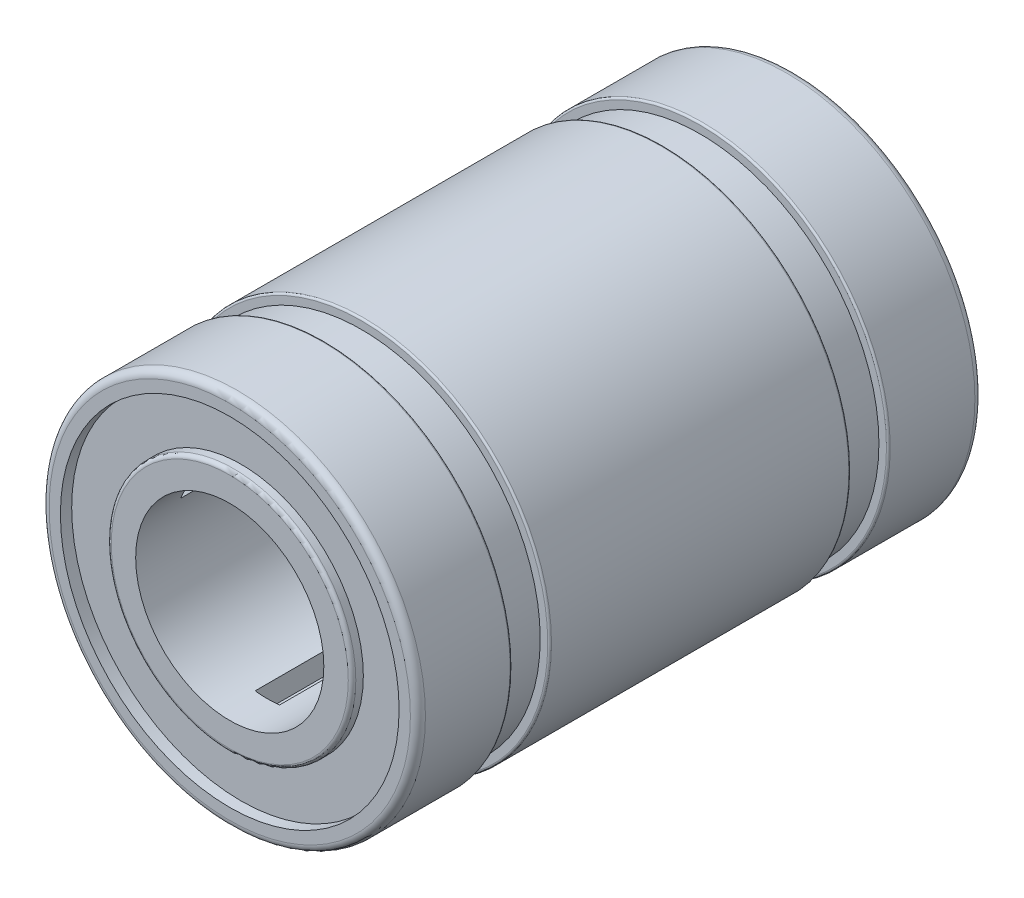
ISO-10303-21;
HEADER;
FILE_DESCRIPTION(('STEP AP214'),'2;1');
FILE_NAME('part.step','',(''),(''),'','','');
FILE_SCHEMA(('AUTOMOTIVE_DESIGN { 1 0 10303 214 1 1 1 1 }'));
ENDSEC;
DATA;
#1=APPLICATION_CONTEXT('core data for automotive mechanical design processes');
#2=APPLICATION_PROTOCOL_DEFINITION('international standard','automotive_design',2000,#1);
#3=PRODUCT_CONTEXT('',#1,'mechanical');
#4=PRODUCT('Part','Part','',(#3));
#5=PRODUCT_RELATED_PRODUCT_CATEGORY('part','',(#4));
#6=PRODUCT_DEFINITION_FORMATION('','',#4);
#7=PRODUCT_DEFINITION_CONTEXT('part definition',#1,'design');
#8=PRODUCT_DEFINITION('design','',#6,#7);
#9=PRODUCT_DEFINITION_SHAPE('','',#8);
#10=(LENGTH_UNIT() NAMED_UNIT(*) SI_UNIT(.MILLI.,.METRE.));
#11=(NAMED_UNIT(*) PLANE_ANGLE_UNIT() SI_UNIT($,.RADIAN.));
#12=(NAMED_UNIT(*) SI_UNIT($,.STERADIAN.) SOLID_ANGLE_UNIT());
#13=UNCERTAINTY_MEASURE_WITH_UNIT(LENGTH_MEASURE(1.E-05),#10,'distance_accuracy_value','');
#14=(GEOMETRIC_REPRESENTATION_CONTEXT(3) GLOBAL_UNCERTAINTY_ASSIGNED_CONTEXT((#13)) GLOBAL_UNIT_ASSIGNED_CONTEXT((#10,
#11,#12)) REPRESENTATION_CONTEXT('',''));
#15=CARTESIAN_POINT('',(0.,0.,0.));
#16=DIRECTION('',(0.,0.,1.));
#17=DIRECTION('',(1.,0.,0.));
#18=AXIS2_PLACEMENT_3D('',#15,#16,#17);
#19=CARTESIAN_POINT('',(-1.83838215350508,0.686207822560546,6.5));
#20=DIRECTION('',(-0.499999999999992,-0.866025403784443,0.));
#21=DIRECTION('',(0.866025403784443,-0.499999999999992,0.));
#22=AXIS2_PLACEMENT_3D('',#19,#20,#21);
#23=PLANE('',#22);
#24=DIRECTION('',(0.866025403784443,-0.499999999999992,0.));
#25=VECTOR('',#24,1.);
#26=CARTESIAN_POINT('',(-1.83838215350508,0.686207822560546,-6.5));
#27=LINE('',#26,#25);
#28=CARTESIAN_POINT('',(-2.81666253555662,1.25101826448092,-6.5));
#29=VERTEX_POINT('',#28);
#30=CARTESIAN_POINT('',(-2.30915894936689,0.958010932379585,-6.5));
#31=VERTEX_POINT('',#30);
#32=EDGE_CURVE('E184',#29,#31,#27,.T.);
#33=ORIENTED_EDGE('',*,*,#32,.F.);
#34=DIRECTION('',(0.,0.,-1.));
#35=VECTOR('',#34,1.);
#36=CARTESIAN_POINT('',(-2.81666253555662,1.25101826448092,6.5));
#37=LINE('',#36,#35);
#38=CARTESIAN_POINT('',(-2.81666253555662,1.25101826448092,6.5));
#39=VERTEX_POINT('',#38);
#40=EDGE_CURVE('E170',#39,#29,#37,.T.);
#41=ORIENTED_EDGE('',*,*,#40,.F.);
#42=DIRECTION('',(-0.866025403784443,0.499999999999992,0.));
#43=VECTOR('',#42,1.);
#44=CARTESIAN_POINT('',(-1.83838215350508,0.686207822560546,6.5));
#45=LINE('',#44,#43);
#46=CARTESIAN_POINT('',(-2.30915894936689,0.958010932379585,6.5));
#47=VERTEX_POINT('',#46);
#48=EDGE_CURVE('E186',#47,#39,#45,.T.);
#49=ORIENTED_EDGE('',*,*,#48,.F.);
#50=DIRECTION('',(0.,0.,-1.));
#51=VECTOR('',#50,1.);
#52=CARTESIAN_POINT('',(-2.30915894936689,0.958010932379585,12.8));
#53=LINE('',#52,#51);
#54=EDGE_CURVE('E62',#31,#47,#53,.F.);
#55=ORIENTED_EDGE('',*,*,#54,.F.);
#56=EDGE_LOOP('',(#33,#41,#49,#55));
#57=FACE_BOUND('',#56,.T.);
#58=ADVANCED_FACE('F47',(#57),#23,.F.);
#59=CARTESIAN_POINT('',(-1.5134644833656,1.24898173551904,6.5));
#60=DIRECTION('',(0.499999999999992,0.866025403784443,0.));
#61=DIRECTION('',(-0.866025403784443,0.499999999999992,0.));
#62=AXIS2_PLACEMENT_3D('',#59,#60,#61);
#63=PLANE('',#62);
#64=DIRECTION('',(-0.866025403784443,0.499999999999992,0.));
#65=VECTOR('',#64,1.);
#66=CARTESIAN_POINT('',(-1.5134644833656,1.24898173551904,-6.5));
#67=LINE('',#66,#65);
#68=CARTESIAN_POINT('',(-1.98424127922741,1.52078484533808,-6.5));
#69=VERTEX_POINT('',#68);
#70=CARTESIAN_POINT('',(-2.49174486541714,1.81379217743941,-6.5));
#71=VERTEX_POINT('',#70);
#72=EDGE_CURVE('E70',#69,#71,#67,.T.);
#73=ORIENTED_EDGE('',*,*,#72,.F.);
#74=DIRECTION('',(0.,0.,-1.));
#75=VECTOR('',#74,1.);
#76=CARTESIAN_POINT('',(-1.98424127922741,1.52078484533808,12.8));
#77=LINE('',#76,#75);
#78=CARTESIAN_POINT('',(-1.98424127922741,1.52078484533808,6.5));
#79=VERTEX_POINT('',#78);
#80=EDGE_CURVE('E230',#79,#69,#77,.T.);
#81=ORIENTED_EDGE('',*,*,#80,.F.);
#82=DIRECTION('',(0.866025403784443,-0.499999999999992,0.));
#83=VECTOR('',#82,1.);
#84=CARTESIAN_POINT('',(-1.5134644833656,1.24898173551904,6.5));
#85=LINE('',#84,#83);
#86=CARTESIAN_POINT('',(-2.49174486541714,1.81379217743941,6.5));
#87=VERTEX_POINT('',#86);
#88=EDGE_CURVE('E183',#87,#79,#85,.T.);
#89=ORIENTED_EDGE('',*,*,#88,.F.);
#90=DIRECTION('',(0.,0.,-1.));
#91=VECTOR('',#90,1.);
#92=CARTESIAN_POINT('',(-2.49174486541714,1.81379217743941,6.5));
#93=LINE('',#92,#91);
#94=EDGE_CURVE('E188',#87,#71,#93,.T.);
#95=ORIENTED_EDGE('',*,*,#94,.T.);
#96=EDGE_LOOP('',(#73,#81,#89,#95));
#97=FACE_BOUND('',#96,.T.);
#98=ADVANCED_FACE('F306',(#97),#63,.F.);
#99=CARTESIAN_POINT('',(-2.81666253555662,1.25101826448092,6.5));
#100=DIRECTION('',(-0.866025403784443,0.499999999999992,0.));
#101=DIRECTION('',(-0.499999999999992,-0.866025403784443,0.));
#102=AXIS2_PLACEMENT_3D('',#99,#100,#101);
#103=PLANE('',#102);
#104=DIRECTION('',(-0.499999999999992,-0.866025403784443,0.));
#105=VECTOR('',#104,1.);
#106=CARTESIAN_POINT('',(-2.81666253555662,1.25101826448092,-6.5));
#107=LINE('',#106,#105);
#108=EDGE_CURVE('E754',#71,#29,#107,.T.);
#109=ORIENTED_EDGE('',*,*,#108,.F.);
#110=ORIENTED_EDGE('',*,*,#94,.F.);
#111=DIRECTION('',(0.499999999999992,0.866025403784443,0.));
#112=VECTOR('',#111,1.);
#113=CARTESIAN_POINT('',(-2.81666253555662,1.25101826448092,6.5));
#114=LINE('',#113,#112);
#115=EDGE_CURVE('E180',#39,#87,#114,.T.);
#116=ORIENTED_EDGE('',*,*,#115,.F.);
#117=ORIENTED_EDGE('',*,*,#40,.T.);
#118=EDGE_LOOP('',(#109,#110,#116,#117));
#119=FACE_BOUND('',#118,.T.);
#120=ADVANCED_FACE('F311',(#119),#103,.F.);
#121=CARTESIAN_POINT('',(1.51346448336558,1.24898173551906,6.5));
#122=DIRECTION('',(-0.500000000000004,0.866025403784436,0.));
#123=DIRECTION('',(-0.866025403784436,-0.500000000000004,0.));
#124=AXIS2_PLACEMENT_3D('',#121,#122,#123);
#125=PLANE('',#124);
#126=DIRECTION('',(-0.866025403784436,-0.500000000000004,0.));
#127=VECTOR('',#126,1.);
#128=CARTESIAN_POINT('',(1.51346448336558,1.24898173551906,-6.5));
#129=LINE('',#128,#127);
#130=CARTESIAN_POINT('',(2.49174486541711,1.81379217743945,-6.5));
#131=VERTEX_POINT('',#130);
#132=CARTESIAN_POINT('',(1.98424127922739,1.52078484533811,-6.5));
#133=VERTEX_POINT('',#132);
#134=EDGE_CURVE('E757',#131,#133,#129,.T.);
#135=ORIENTED_EDGE('',*,*,#134,.F.);
#136=DIRECTION('',(0.,0.,-1.));
#137=VECTOR('',#136,1.);
#138=CARTESIAN_POINT('',(2.49174486541711,1.81379217743945,6.5));
#139=LINE('',#138,#137);
#140=CARTESIAN_POINT('',(2.49174486541711,1.81379217743945,6.5));
#141=VERTEX_POINT('',#140);
#142=EDGE_CURVE('E175',#141,#131,#139,.T.);
#143=ORIENTED_EDGE('',*,*,#142,.F.);
#144=DIRECTION('',(0.866025403784436,0.500000000000004,0.));
#145=VECTOR('',#144,1.);
#146=CARTESIAN_POINT('',(1.51346448336558,1.24898173551906,6.5));
#147=LINE('',#146,#145);
#148=CARTESIAN_POINT('',(1.98424127922739,1.52078484533811,6.5));
#149=VERTEX_POINT('',#148);
#150=EDGE_CURVE('E172',#149,#141,#147,.T.);
#151=ORIENTED_EDGE('',*,*,#150,.F.);
#152=DIRECTION('',(0.,0.,-1.));
#153=VECTOR('',#152,1.);
#154=CARTESIAN_POINT('',(1.98424127922739,1.52078484533811,12.8));
#155=LINE('',#154,#153);
#156=EDGE_CURVE('E239',#133,#149,#155,.F.);
#157=ORIENTED_EDGE('',*,*,#156,.F.);
#158=EDGE_LOOP('',(#135,#143,#151,#157));
#159=FACE_BOUND('',#158,.T.);
#160=ADVANCED_FACE('F319',(#159),#125,.F.);
#161=CARTESIAN_POINT('',(1.83838215350507,0.686207822560572,6.5));
#162=DIRECTION('',(0.500000000000004,-0.866025403784436,0.));
#163=DIRECTION('',(0.866025403784436,0.500000000000004,0.));
#164=AXIS2_PLACEMENT_3D('',#161,#162,#163);
#165=PLANE('',#164);
#166=DIRECTION('',(0.866025403784436,0.500000000000004,0.));
#167=VECTOR('',#166,1.);
#168=CARTESIAN_POINT('',(1.83838215350507,0.686207822560572,-6.5));
#169=LINE('',#168,#167);
#170=CARTESIAN_POINT('',(2.30915894936688,0.958010932379617,-6.5));
#171=VERTEX_POINT('',#170);
#172=CARTESIAN_POINT('',(2.8166625355566,1.25101826448096,-6.5));
#173=VERTEX_POINT('',#172);
#174=EDGE_CURVE('E761',#171,#173,#169,.T.);
#175=ORIENTED_EDGE('',*,*,#174,.F.);
#176=DIRECTION('',(0.,0.,-1.));
#177=VECTOR('',#176,1.);
#178=CARTESIAN_POINT('',(2.30915894936688,0.958010932379617,12.8));
#179=LINE('',#178,#177);
#180=CARTESIAN_POINT('',(2.30915894936688,0.958010932379617,6.5));
#181=VERTEX_POINT('',#180);
#182=EDGE_CURVE('E236',#181,#171,#179,.T.);
#183=ORIENTED_EDGE('',*,*,#182,.F.);
#184=DIRECTION('',(-0.866025403784436,-0.500000000000004,0.));
#185=VECTOR('',#184,1.);
#186=CARTESIAN_POINT('',(1.83838215350507,0.686207822560572,6.5));
#187=LINE('',#186,#185);
#188=CARTESIAN_POINT('',(2.8166625355566,1.25101826448096,6.5));
#189=VERTEX_POINT('',#188);
#190=EDGE_CURVE('E169',#189,#181,#187,.T.);
#191=ORIENTED_EDGE('',*,*,#190,.F.);
#192=DIRECTION('',(0.,0.,-1.));
#193=VECTOR('',#192,1.);
#194=CARTESIAN_POINT('',(2.8166625355566,1.25101826448096,6.5));
#195=LINE('',#194,#193);
#196=EDGE_CURVE('E174',#189,#173,#195,.T.);
#197=ORIENTED_EDGE('',*,*,#196,.T.);
#198=EDGE_LOOP('',(#175,#183,#191,#197));
#199=FACE_BOUND('',#198,.T.);
#200=ADVANCED_FACE('F538',(#199),#165,.F.);
#201=CARTESIAN_POINT('',(2.49174486541711,1.81379217743945,6.5));
#202=DIRECTION('',(0.866025403784436,0.500000000000004,0.));
#203=DIRECTION('',(-0.500000000000004,0.866025403784436,0.));
#204=AXIS2_PLACEMENT_3D('',#201,#202,#203);
#205=PLANE('',#204);
#206=DIRECTION('',(-0.500000000000004,0.866025403784436,0.));
#207=VECTOR('',#206,1.);
#208=CARTESIAN_POINT('',(2.49174486541711,1.81379217743945,-6.5));
#209=LINE('',#208,#207);
#210=EDGE_CURVE('E775',#173,#131,#209,.T.);
#211=ORIENTED_EDGE('',*,*,#210,.F.);
#212=ORIENTED_EDGE('',*,*,#196,.F.);
#213=DIRECTION('',(0.500000000000004,-0.866025403784436,0.));
#214=VECTOR('',#213,1.);
#215=CARTESIAN_POINT('',(2.49174486541711,1.81379217743945,6.5));
#216=LINE('',#215,#214);
#217=EDGE_CURVE('E166',#141,#189,#216,.T.);
#218=ORIENTED_EDGE('',*,*,#217,.F.);
#219=ORIENTED_EDGE('',*,*,#142,.T.);
#220=EDGE_LOOP('',(#211,#212,#218,#219));
#221=FACE_BOUND('',#220,.T.);
#222=ADVANCED_FACE('F549',(#221),#205,.F.);
#223=CARTESIAN_POINT('',(-0.324917670139485,-1.93518955807962,6.5));
#224=DIRECTION('',(-1.,0.,0.));
#225=DIRECTION('',(0.,0.,1.));
#226=AXIS2_PLACEMENT_3D('',#223,#224,#225);
#227=PLANE('',#226);
#228=DIRECTION('',(0.,-1.,0.));
#229=VECTOR('',#228,1.);
#230=CARTESIAN_POINT('',(-0.324917670139485,-1.93518955807962,-6.5));
#231=LINE('',#230,#229);
#232=CARTESIAN_POINT('',(-0.324917670139485,-2.47879577771771,-6.5));
#233=VERTEX_POINT('',#232);
#234=CARTESIAN_POINT('',(-0.324917670139485,-3.06481044192038,-6.5));
#235=VERTEX_POINT('',#234);
#236=EDGE_CURVE('E767',#233,#235,#231,.T.);
#237=ORIENTED_EDGE('',*,*,#236,.F.);
#238=DIRECTION('',(0.,0.,-1.));
#239=VECTOR('',#238,1.);
#240=CARTESIAN_POINT('',(-0.324917670139485,-2.47879577771771,12.8));
#241=LINE('',#240,#239);
#242=CARTESIAN_POINT('',(-0.324917670139485,-2.47879577771771,6.5));
#243=VERTEX_POINT('',#242);
#244=EDGE_CURVE('E244',#243,#233,#241,.T.);
#245=ORIENTED_EDGE('',*,*,#244,.F.);
#246=DIRECTION('',(0.,1.,0.));
#247=VECTOR('',#246,1.);
#248=CARTESIAN_POINT('',(-0.324917670139485,-1.93518955807962,6.5));
#249=LINE('',#248,#247);
#250=CARTESIAN_POINT('',(-0.324917670139485,-3.06481044192038,6.5));
#251=VERTEX_POINT('',#250);
#252=EDGE_CURVE('E147',#251,#243,#249,.T.);
#253=ORIENTED_EDGE('',*,*,#252,.F.);
#254=DIRECTION('',(0.,0.,-1.));
#255=VECTOR('',#254,1.);
#256=CARTESIAN_POINT('',(-0.324917670139485,-3.06481044192038,6.5));
#257=LINE('',#256,#255);
#258=EDGE_CURVE('E156',#251,#235,#257,.T.);
#259=ORIENTED_EDGE('',*,*,#258,.T.);
#260=EDGE_LOOP('',(#237,#245,#253,#259));
#261=FACE_BOUND('',#260,.T.);
#262=ADVANCED_FACE('F560',(#261),#227,.F.);
#263=CARTESIAN_POINT('',(0.324917670139485,-1.93518955807962,6.5));
#264=DIRECTION('',(1.,0.,0.));
#265=DIRECTION('',(0.,0.,-1.));
#266=AXIS2_PLACEMENT_3D('',#263,#264,#265);
#267=PLANE('',#266);
#268=DIRECTION('',(0.,1.,0.));
#269=VECTOR('',#268,1.);
#270=CARTESIAN_POINT('',(0.324917670139485,-1.93518955807962,-6.5));
#271=LINE('',#270,#269);
#272=CARTESIAN_POINT('',(0.324917670139485,-3.06481044192038,-6.5));
#273=VERTEX_POINT('',#272);
#274=CARTESIAN_POINT('',(0.324917670139485,-2.47879577771771,-6.5));
#275=VERTEX_POINT('',#274);
#276=EDGE_CURVE('E153',#273,#275,#271,.T.);
#277=ORIENTED_EDGE('',*,*,#276,.F.);
#278=DIRECTION('',(0.,0.,-1.));
#279=VECTOR('',#278,1.);
#280=CARTESIAN_POINT('',(0.324917670139485,-3.06481044192038,6.5));
#281=LINE('',#280,#279);
#282=CARTESIAN_POINT('',(0.324917670139485,-3.06481044192038,6.5));
#283=VERTEX_POINT('',#282);
#284=EDGE_CURVE('E150',#283,#273,#281,.T.);
#285=ORIENTED_EDGE('',*,*,#284,.F.);
#286=DIRECTION('',(0.,-1.,0.));
#287=VECTOR('',#286,1.);
#288=CARTESIAN_POINT('',(0.324917670139485,-1.93518955807962,6.5));
#289=LINE('',#288,#287);
#290=CARTESIAN_POINT('',(0.324917670139485,-2.47879577771771,6.5));
#291=VERTEX_POINT('',#290);
#292=EDGE_CURVE('E139',#291,#283,#289,.T.);
#293=ORIENTED_EDGE('',*,*,#292,.F.);
#294=DIRECTION('',(0.,0.,-1.));
#295=VECTOR('',#294,1.);
#296=CARTESIAN_POINT('',(0.324917670139485,-2.47879577771771,12.8));
#297=LINE('',#296,#295);
#298=EDGE_CURVE('E242',#275,#291,#297,.F.);
#299=ORIENTED_EDGE('',*,*,#298,.F.);
#300=EDGE_LOOP('',(#277,#285,#293,#299));
#301=FACE_BOUND('',#300,.T.);
#302=ADVANCED_FACE('F151',(#301),#267,.F.);
#303=CARTESIAN_POINT('',(0.324917670139485,-3.06481044192038,6.5));
#304=DIRECTION('',(0.,-1.,0.));
#305=DIRECTION('',(0.,0.,-1.));
#306=AXIS2_PLACEMENT_3D('',#303,#304,#305);
#307=PLANE('',#306);
#308=DIRECTION('',(1.,0.,0.));
#309=VECTOR('',#308,1.);
#310=CARTESIAN_POINT('',(0.324917670139485,-3.06481044192038,-6.5));
#311=LINE('',#310,#309);
#312=EDGE_CURVE('E247',#235,#273,#311,.T.);
#313=ORIENTED_EDGE('',*,*,#312,.F.);
#314=ORIENTED_EDGE('',*,*,#258,.F.);
#315=DIRECTION('',(-1.,0.,0.));
#316=VECTOR('',#315,1.);
#317=CARTESIAN_POINT('',(0.324917670139485,-3.06481044192038,6.5));
#318=LINE('',#317,#316);
#319=EDGE_CURVE('E143',#283,#251,#318,.T.);
#320=ORIENTED_EDGE('',*,*,#319,.F.);
#321=ORIENTED_EDGE('',*,*,#284,.T.);
#322=EDGE_LOOP('',(#313,#314,#320,#321));
#323=FACE_BOUND('',#322,.T.);
#324=ADVANCED_FACE('F158',(#323),#307,.F.);
#325=CARTESIAN_POINT('',(0.,0.,-4.));
#326=DIRECTION('',(0.,0.,1.));
#327=DIRECTION('',(1.,0.,0.));
#328=AXIS2_PLACEMENT_3D('',#325,#326,#327);
#329=CYLINDRICAL_SURFACE('',#328,5.);
#330=CARTESIAN_POINT('',(0.,0.,3.95));
#331=DIRECTION('',(0.,0.,1.));
#332=DIRECTION('',(1.,0.,0.));
#333=AXIS2_PLACEMENT_3D('',#330,#331,#332);
#334=CIRCLE('',#333,5.);
#335=CARTESIAN_POINT('',(5.,0.,3.95));
#336=VERTEX_POINT('',#335);
#337=EDGE_CURVE('E273',#336,#336,#334,.F.);
#338=ORIENTED_EDGE('',*,*,#337,.T.);
#339=EDGE_LOOP('',(#338));
#340=FACE_BOUND('',#339,.T.);
#341=CARTESIAN_POINT('',(0.,0.,-3.95));
#342=DIRECTION('',(0.,0.,1.));
#343=DIRECTION('',(1.,0.,0.));
#344=AXIS2_PLACEMENT_3D('',#341,#342,#343);
#345=CIRCLE('',#344,5.);
#346=CARTESIAN_POINT('',(5.,0.,-3.95));
#347=VERTEX_POINT('',#346);
#348=EDGE_CURVE('E270',#347,#347,#345,.T.);
#349=ORIENTED_EDGE('',*,*,#348,.T.);
#350=EDGE_LOOP('',(#349));
#351=FACE_BOUND('',#350,.T.);
#352=ADVANCED_FACE('F391',(#340,#351),#329,.T.);
#353=CARTESIAN_POINT('',(0.,0.,-4.));
#354=DIRECTION('',(0.,0.,1.));
#355=DIRECTION('',(1.,0.,0.));
#356=AXIS2_PLACEMENT_3D('',#353,#354,#355);
#357=PLANE('',#356);
#358=CARTESIAN_POINT('',(0.,0.,-4.));
#359=DIRECTION('',(0.,0.,1.));
#360=DIRECTION('',(1.,0.,0.));
#361=AXIS2_PLACEMENT_3D('',#358,#359,#360);
#362=CIRCLE('',#361,4.95);
#363=CARTESIAN_POINT('',(4.95,0.,-4.));
#364=VERTEX_POINT('',#363);
#365=EDGE_CURVE('E276',#364,#364,#362,.F.);
#366=ORIENTED_EDGE('',*,*,#365,.T.);
#367=EDGE_LOOP('',(#366));
#368=FACE_BOUND('',#367,.T.);
#369=CARTESIAN_POINT('',(0.,0.,-4.));
#370=DIRECTION('',(0.,0.,1.));
#371=DIRECTION('',(1.,0.,0.));
#372=AXIS2_PLACEMENT_3D('',#369,#370,#371);
#373=CIRCLE('',#372,4.75);
#374=CARTESIAN_POINT('',(4.75,0.,-4.));
#375=VERTEX_POINT('',#374);
#376=EDGE_CURVE('E217',#375,#375,#373,.T.);
#377=ORIENTED_EDGE('',*,*,#376,.T.);
#378=EDGE_LOOP('',(#377));
#379=FACE_BOUND('',#378,.T.);
#380=ADVANCED_FACE('F387',(#368,#379),#357,.F.);
#381=CARTESIAN_POINT('',(0.,0.,4.));
#382=DIRECTION('',(0.,0.,1.));
#383=DIRECTION('',(1.,0.,0.));
#384=AXIS2_PLACEMENT_3D('',#381,#382,#383);
#385=PLANE('',#384);
#386=CARTESIAN_POINT('',(0.,0.,4.));
#387=DIRECTION('',(0.,0.,1.));
#388=DIRECTION('',(1.,0.,0.));
#389=AXIS2_PLACEMENT_3D('',#386,#387,#388);
#390=CIRCLE('',#389,4.95);
#391=CARTESIAN_POINT('',(4.95,0.,4.));
#392=VERTEX_POINT('',#391);
#393=EDGE_CURVE('E267',#392,#392,#390,.T.);
#394=ORIENTED_EDGE('',*,*,#393,.T.);
#395=EDGE_LOOP('',(#394));
#396=FACE_BOUND('',#395,.T.);
#397=CARTESIAN_POINT('',(0.,0.,4.));
#398=DIRECTION('',(0.,0.,1.));
#399=DIRECTION('',(1.,0.,0.));
#400=AXIS2_PLACEMENT_3D('',#397,#398,#399);
#401=CIRCLE('',#400,4.75);
#402=CARTESIAN_POINT('',(4.75,0.,4.));
#403=VERTEX_POINT('',#402);
#404=EDGE_CURVE('E222',#403,#403,#401,.T.);
#405=ORIENTED_EDGE('',*,*,#404,.F.);
#406=EDGE_LOOP('',(#405));
#407=FACE_BOUND('',#406,.T.);
#408=ADVANCED_FACE('F383',(#396,#407),#385,.T.);
#409=CARTESIAN_POINT('',(0.,0.,-5.));
#410=DIRECTION('',(0.,0.,1.));
#411=DIRECTION('',(1.,0.,0.));
#412=AXIS2_PLACEMENT_3D('',#409,#410,#411);
#413=CYLINDRICAL_SURFACE('',#412,4.75);
#414=ORIENTED_EDGE('',*,*,#404,.T.);
#415=EDGE_LOOP('',(#414));
#416=FACE_BOUND('',#415,.T.);
#417=CARTESIAN_POINT('',(0.,0.,5.));
#418=DIRECTION('',(0.,0.,1.));
#419=DIRECTION('',(1.,0.,0.));
#420=AXIS2_PLACEMENT_3D('',#417,#418,#419);
#421=CIRCLE('',#420,4.75);
#422=CARTESIAN_POINT('',(4.75,0.,5.));
#423=VERTEX_POINT('',#422);
#424=EDGE_CURVE('E214',#423,#423,#421,.T.);
#425=ORIENTED_EDGE('',*,*,#424,.F.);
#426=EDGE_LOOP('',(#425));
#427=FACE_BOUND('',#426,.T.);
#428=ADVANCED_FACE('F380',(#416,#427),#413,.T.);
#429=CARTESIAN_POINT('',(0.,0.,-5.));
#430=DIRECTION('',(0.,0.,1.));
#431=DIRECTION('',(1.,0.,0.));
#432=AXIS2_PLACEMENT_3D('',#429,#430,#431);
#433=CIRCLE('',#432,4.75);
#434=CARTESIAN_POINT('',(4.75,0.,-5.));
#435=VERTEX_POINT('',#434);
#436=EDGE_CURVE('E211',#435,#435,#433,.T.);
#437=ORIENTED_EDGE('',*,*,#436,.T.);
#438=EDGE_LOOP('',(#437));
#439=FACE_BOUND('',#438,.T.);
#440=ORIENTED_EDGE('',*,*,#376,.F.);
#441=EDGE_LOOP('',(#440));
#442=FACE_BOUND('',#441,.T.);
#443=ADVANCED_FACE('F378',(#439,#442),#413,.T.);
#444=CARTESIAN_POINT('',(0.,0.,7.5));
#445=DIRECTION('',(0.,0.,-1.));
#446=DIRECTION('',(-1.,0.,0.));
#447=AXIS2_PLACEMENT_3D('',#444,#445,#446);
#448=CYLINDRICAL_SURFACE('',#447,5.);
#449=CARTESIAN_POINT('',(0.,0.,5.05));
#450=DIRECTION('',(0.,0.,1.));
#451=DIRECTION('',(1.,0.,0.));
#452=AXIS2_PLACEMENT_3D('',#449,#450,#451);
#453=CIRCLE('',#452,5.);
#454=CARTESIAN_POINT('',(5.,0.,5.05));
#455=VERTEX_POINT('',#454);
#456=EDGE_CURVE('E261',#455,#455,#453,.T.);
#457=ORIENTED_EDGE('',*,*,#456,.T.);
#458=EDGE_LOOP('',(#457));
#459=FACE_BOUND('',#458,.T.);
#460=CARTESIAN_POINT('',(0.,0.,7.3));
#461=DIRECTION('',(0.,0.,1.));
#462=DIRECTION('',(1.,0.,0.));
#463=AXIS2_PLACEMENT_3D('',#460,#461,#462);
#464=CIRCLE('',#463,5.);
#465=CARTESIAN_POINT('',(5.,0.,7.3));
#466=VERTEX_POINT('',#465);
#467=EDGE_CURVE('E252',#466,#466,#464,.F.);
#468=ORIENTED_EDGE('',*,*,#467,.T.);
#469=EDGE_LOOP('',(#468));
#470=FACE_BOUND('',#469,.T.);
#471=ADVANCED_FACE('F371',(#459,#470),#448,.T.);
#472=CARTESIAN_POINT('',(0.,0.,7.5));
#473=DIRECTION('',(0.,0.,1.));
#474=DIRECTION('',(1.,0.,0.));
#475=AXIS2_PLACEMENT_3D('',#472,#473,#474);
#476=PLANE('',#475);
#477=CARTESIAN_POINT('',(0.,0.,7.5));
#478=DIRECTION('',(0.,0.,1.));
#479=DIRECTION('',(1.,0.,0.));
#480=AXIS2_PLACEMENT_3D('',#477,#478,#479);
#481=CIRCLE('',#480,4.8);
#482=CARTESIAN_POINT('',(4.8,0.,7.5));
#483=VERTEX_POINT('',#482);
#484=EDGE_CURVE('E249',#483,#483,#481,.T.);
#485=ORIENTED_EDGE('',*,*,#484,.T.);
#486=EDGE_LOOP('',(#485));
#487=FACE_BOUND('',#486,.T.);
#488=CARTESIAN_POINT('',(0.,0.,7.5));
#489=DIRECTION('',(0.,0.,1.));
#490=DIRECTION('',(1.,0.,0.));
#491=AXIS2_PLACEMENT_3D('',#488,#489,#490);
#492=CIRCLE('',#491,4.5);
#493=CARTESIAN_POINT('',(4.5,0.,7.5));
#494=VERTEX_POINT('',#493);
#495=EDGE_CURVE('E205',#494,#494,#492,.T.);
#496=ORIENTED_EDGE('',*,*,#495,.F.);
#497=EDGE_LOOP('',(#496));
#498=FACE_BOUND('',#497,.T.);
#499=ADVANCED_FACE('F368',(#487,#498),#476,.T.);
#500=CARTESIAN_POINT('',(0.,0.,5.));
#501=DIRECTION('',(0.,0.,1.));
#502=DIRECTION('',(1.,0.,0.));
#503=AXIS2_PLACEMENT_3D('',#500,#501,#502);
#504=PLANE('',#503);
#505=CARTESIAN_POINT('',(0.,0.,5.));
#506=DIRECTION('',(0.,0.,1.));
#507=DIRECTION('',(1.,0.,0.));
#508=AXIS2_PLACEMENT_3D('',#505,#506,#507);
#509=CIRCLE('',#508,4.95);
#510=CARTESIAN_POINT('',(4.95,0.,5.));
#511=VERTEX_POINT('',#510);
#512=EDGE_CURVE('E264',#511,#511,#509,.F.);
#513=ORIENTED_EDGE('',*,*,#512,.T.);
#514=EDGE_LOOP('',(#513));
#515=FACE_BOUND('',#514,.T.);
#516=ORIENTED_EDGE('',*,*,#424,.T.);
#517=EDGE_LOOP('',(#516));
#518=FACE_BOUND('',#517,.T.);
#519=ADVANCED_FACE('F366',(#515,#518),#504,.F.);
#520=CARTESIAN_POINT('',(0.,0.,-7.5));
#521=DIRECTION('',(0.,0.,1.));
#522=DIRECTION('',(1.,0.,0.));
#523=AXIS2_PLACEMENT_3D('',#520,#521,#522);
#524=CYLINDRICAL_SURFACE('',#523,5.);
#525=CARTESIAN_POINT('',(0.,0.,-5.05));
#526=DIRECTION('',(0.,0.,-1.));
#527=DIRECTION('',(-1.,0.,0.));
#528=AXIS2_PLACEMENT_3D('',#525,#526,#527);
#529=CIRCLE('',#528,5.);
#530=CARTESIAN_POINT('',(-5.,0.,-5.05));
#531=VERTEX_POINT('',#530);
#532=EDGE_CURVE('E279',#531,#531,#529,.T.);
#533=ORIENTED_EDGE('',*,*,#532,.T.);
#534=EDGE_LOOP('',(#533));
#535=FACE_BOUND('',#534,.T.);
#536=CARTESIAN_POINT('',(0.,0.,-7.3));
#537=DIRECTION('',(0.,0.,-1.));
#538=DIRECTION('',(-1.,0.,0.));
#539=AXIS2_PLACEMENT_3D('',#536,#537,#538);
#540=CIRCLE('',#539,5.);
#541=CARTESIAN_POINT('',(-5.,0.,-7.3));
#542=VERTEX_POINT('',#541);
#543=EDGE_CURVE('E258',#542,#542,#540,.F.);
#544=ORIENTED_EDGE('',*,*,#543,.T.);
#545=EDGE_LOOP('',(#544));
#546=FACE_BOUND('',#545,.T.);
#547=ADVANCED_FACE('F359',(#535,#546),#524,.T.);
#548=CARTESIAN_POINT('',(0.,0.,-7.5));
#549=DIRECTION('',(0.,0.,-1.));
#550=DIRECTION('',(-1.,0.,0.));
#551=AXIS2_PLACEMENT_3D('',#548,#549,#550);
#552=PLANE('',#551);
#553=CARTESIAN_POINT('',(0.,0.,-7.5));
#554=DIRECTION('',(0.,0.,-1.));
#555=DIRECTION('',(-1.,0.,0.));
#556=AXIS2_PLACEMENT_3D('',#553,#554,#555);
#557=CIRCLE('',#556,4.8);
#558=CARTESIAN_POINT('',(-4.8,0.,-7.5));
#559=VERTEX_POINT('',#558);
#560=EDGE_CURVE('E255',#559,#559,#557,.T.);
#561=ORIENTED_EDGE('',*,*,#560,.T.);
#562=EDGE_LOOP('',(#561));
#563=FACE_BOUND('',#562,.T.);
#564=CARTESIAN_POINT('',(0.,0.,-7.5));
#565=DIRECTION('',(0.,0.,-1.));
#566=DIRECTION('',(-1.,0.,0.));
#567=AXIS2_PLACEMENT_3D('',#564,#565,#566);
#568=CIRCLE('',#567,4.5);
#569=CARTESIAN_POINT('',(-4.5,0.,-7.5));
#570=VERTEX_POINT('',#569);
#571=EDGE_CURVE('E201',#570,#570,#568,.T.);
#572=ORIENTED_EDGE('',*,*,#571,.F.);
#573=EDGE_LOOP('',(#572));
#574=FACE_BOUND('',#573,.T.);
#575=ADVANCED_FACE('F356',(#563,#574),#552,.T.);
#576=CARTESIAN_POINT('',(0.,0.,-5.));
#577=DIRECTION('',(0.,0.,-1.));
#578=DIRECTION('',(-1.,0.,0.));
#579=AXIS2_PLACEMENT_3D('',#576,#577,#578);
#580=PLANE('',#579);
#581=CARTESIAN_POINT('',(0.,0.,-5.));
#582=DIRECTION('',(0.,0.,-1.));
#583=DIRECTION('',(-1.,0.,0.));
#584=AXIS2_PLACEMENT_3D('',#581,#582,#583);
#585=CIRCLE('',#584,4.95);
#586=CARTESIAN_POINT('',(-4.95,0.,-5.));
#587=VERTEX_POINT('',#586);
#588=EDGE_CURVE('E282',#587,#587,#585,.F.);
#589=ORIENTED_EDGE('',*,*,#588,.T.);
#590=EDGE_LOOP('',(#589));
#591=FACE_BOUND('',#590,.T.);
#592=ORIENTED_EDGE('',*,*,#436,.F.);
#593=EDGE_LOOP('',(#592));
#594=FACE_BOUND('',#593,.T.);
#595=ADVANCED_FACE('F354',(#591,#594),#580,.F.);
#596=CARTESIAN_POINT('',(0.,0.,7.2));
#597=DIRECTION('',(0.,0.,1.));
#598=DIRECTION('',(1.,0.,0.));
#599=AXIS2_PLACEMENT_3D('',#596,#597,#598);
#600=CYLINDRICAL_SURFACE('',#599,4.5);
#601=CARTESIAN_POINT('',(0.,0.,7.2));
#602=DIRECTION('',(0.,0.,1.));
#603=DIRECTION('',(1.,0.,0.));
#604=AXIS2_PLACEMENT_3D('',#601,#602,#603);
#605=CIRCLE('',#604,4.5);
#606=CARTESIAN_POINT('',(4.5,0.,7.2));
#607=VERTEX_POINT('',#606);
#608=EDGE_CURVE('E208',#607,#607,#605,.T.);
#609=ORIENTED_EDGE('',*,*,#608,.F.);
#610=EDGE_LOOP('',(#609));
#611=FACE_BOUND('',#610,.T.);
#612=ORIENTED_EDGE('',*,*,#495,.T.);
#613=EDGE_LOOP('',(#612));
#614=FACE_BOUND('',#613,.T.);
#615=ADVANCED_FACE('F350',(#611,#614),#600,.F.);
#616=CARTESIAN_POINT('',(0.,0.,7.2));
#617=DIRECTION('',(0.,0.,1.));
#618=DIRECTION('',(1.,0.,0.));
#619=AXIS2_PLACEMENT_3D('',#616,#617,#618);
#620=PLANE('',#619);
#621=CARTESIAN_POINT('',(0.,0.,7.2));
#622=DIRECTION('',(0.,0.,1.));
#623=DIRECTION('',(1.,0.,0.));
#624=AXIS2_PLACEMENT_3D('',#621,#622,#623);
#625=CIRCLE('',#624,3.25);
#626=CARTESIAN_POINT('',(3.25,0.,7.2));
#627=VERTEX_POINT('',#626);
#628=EDGE_CURVE('E195',#627,#627,#625,.T.);
#629=ORIENTED_EDGE('',*,*,#628,.F.);
#630=EDGE_LOOP('',(#629));
#631=FACE_BOUND('',#630,.T.);
#632=ORIENTED_EDGE('',*,*,#608,.T.);
#633=EDGE_LOOP('',(#632));
#634=FACE_BOUND('',#633,.T.);
#635=ADVANCED_FACE('F346',(#631,#634),#620,.T.);
#636=CARTESIAN_POINT('',(0.,0.,-7.2));
#637=DIRECTION('',(0.,0.,-1.));
#638=DIRECTION('',(-1.,0.,0.));
#639=AXIS2_PLACEMENT_3D('',#636,#637,#638);
#640=CYLINDRICAL_SURFACE('',#639,4.5);
#641=CARTESIAN_POINT('',(0.,0.,-7.2));
#642=DIRECTION('',(0.,0.,-1.));
#643=DIRECTION('',(-1.,0.,0.));
#644=AXIS2_PLACEMENT_3D('',#641,#642,#643);
#645=CIRCLE('',#644,4.5);
#646=CARTESIAN_POINT('',(-4.5,0.,-7.2));
#647=VERTEX_POINT('',#646);
#648=EDGE_CURVE('E202',#647,#647,#645,.T.);
#649=ORIENTED_EDGE('',*,*,#648,.F.);
#650=EDGE_LOOP('',(#649));
#651=FACE_BOUND('',#650,.T.);
#652=ORIENTED_EDGE('',*,*,#571,.T.);
#653=EDGE_LOOP('',(#652));
#654=FACE_BOUND('',#653,.T.);
#655=ADVANCED_FACE('F342',(#651,#654),#640,.F.);
#656=CARTESIAN_POINT('',(0.,0.,-7.2));
#657=DIRECTION('',(0.,0.,-1.));
#658=DIRECTION('',(-1.,0.,0.));
#659=AXIS2_PLACEMENT_3D('',#656,#657,#658);
#660=PLANE('',#659);
#661=CARTESIAN_POINT('',(0.,0.,-7.2));
#662=DIRECTION('',(0.,0.,-1.));
#663=DIRECTION('',(-1.,0.,0.));
#664=AXIS2_PLACEMENT_3D('',#661,#662,#663);
#665=CIRCLE('',#664,3.25);
#666=CARTESIAN_POINT('',(-3.25,0.,-7.2));
#667=VERTEX_POINT('',#666);
#668=EDGE_CURVE('E198',#667,#667,#665,.T.);
#669=ORIENTED_EDGE('',*,*,#668,.F.);
#670=EDGE_LOOP('',(#669));
#671=FACE_BOUND('',#670,.T.);
#672=ORIENTED_EDGE('',*,*,#648,.T.);
#673=EDGE_LOOP('',(#672));
#674=FACE_BOUND('',#673,.T.);
#675=ADVANCED_FACE('F338',(#671,#674),#660,.T.);
#676=CARTESIAN_POINT('',(0.,0.,-7.5));
#677=DIRECTION('',(0.,0.,1.));
#678=DIRECTION('',(1.,0.,0.));
#679=AXIS2_PLACEMENT_3D('',#676,#677,#678);
#680=CYLINDRICAL_SURFACE('',#679,3.25);
#681=CARTESIAN_POINT('',(0.,0.,-7.4));
#682=DIRECTION('',(0.,0.,-1.));
#683=DIRECTION('',(-1.,0.,0.));
#684=AXIS2_PLACEMENT_3D('',#681,#682,#683);
#685=CIRCLE('',#684,3.25);
#686=CARTESIAN_POINT('',(-3.25,0.,-7.4));
#687=VERTEX_POINT('',#686);
#688=EDGE_CURVE('E11',#687,#687,#685,.F.);
#689=ORIENTED_EDGE('',*,*,#688,.T.);
#690=EDGE_LOOP('',(#689));
#691=FACE_BOUND('',#690,.T.);
#692=ORIENTED_EDGE('',*,*,#668,.T.);
#693=EDGE_LOOP('',(#692));
#694=FACE_BOUND('',#693,.T.);
#695=ADVANCED_FACE('F335',(#691,#694),#680,.T.);
#696=CARTESIAN_POINT('',(0.,0.,-7.5));
#697=DIRECTION('',(0.,0.,-1.));
#698=DIRECTION('',(-1.,0.,0.));
#699=AXIS2_PLACEMENT_3D('',#696,#697,#698);
#700=PLANE('',#699);
#701=CARTESIAN_POINT('',(0.,0.,-7.5));
#702=DIRECTION('',(0.,0.,-1.));
#703=DIRECTION('',(-1.,0.,0.));
#704=AXIS2_PLACEMENT_3D('',#701,#702,#703);
#705=CIRCLE('',#704,3.15);
#706=CARTESIAN_POINT('',(-3.15,0.,-7.5));
#707=VERTEX_POINT('',#706);
#708=EDGE_CURVE('E55',#707,#707,#705,.T.);
#709=ORIENTED_EDGE('',*,*,#708,.T.);
#710=EDGE_LOOP('',(#709));
#711=FACE_BOUND('',#710,.T.);
#712=CARTESIAN_POINT('',(0.,0.,-7.5));
#713=DIRECTION('',(0.,0.,-1.));
#714=DIRECTION('',(-1.,0.,0.));
#715=AXIS2_PLACEMENT_3D('',#712,#713,#714);
#716=CIRCLE('',#715,2.5);
#717=CARTESIAN_POINT('',(-2.5,0.,-7.5));
#718=VERTEX_POINT('',#717);
#719=EDGE_CURVE('E164',#718,#718,#716,.T.);
#720=ORIENTED_EDGE('',*,*,#719,.F.);
#721=EDGE_LOOP('',(#720));
#722=FACE_BOUND('',#721,.T.);
#723=ADVANCED_FACE('F293',(#711,#722),#700,.T.);
#724=CARTESIAN_POINT('',(0.,0.,7.5));
#725=DIRECTION('',(0.,0.,-1.));
#726=DIRECTION('',(-1.,0.,0.));
#727=AXIS2_PLACEMENT_3D('',#724,#725,#726);
#728=CYLINDRICAL_SURFACE('',#727,3.25);
#729=CARTESIAN_POINT('',(0.,0.,7.4));
#730=DIRECTION('',(0.,0.,1.));
#731=DIRECTION('',(1.,0.,0.));
#732=AXIS2_PLACEMENT_3D('',#729,#730,#731);
#733=CIRCLE('',#732,3.25);
#734=CARTESIAN_POINT('',(3.25,0.,7.4));
#735=VERTEX_POINT('',#734);
#736=EDGE_CURVE('E288',#735,#735,#733,.F.);
#737=ORIENTED_EDGE('',*,*,#736,.T.);
#738=EDGE_LOOP('',(#737));
#739=FACE_BOUND('',#738,.T.);
#740=ORIENTED_EDGE('',*,*,#628,.T.);
#741=EDGE_LOOP('',(#740));
#742=FACE_BOUND('',#741,.T.);
#743=ADVANCED_FACE('F328',(#739,#742),#728,.T.);
#744=CARTESIAN_POINT('',(0.,0.,7.5));
#745=DIRECTION('',(0.,0.,1.));
#746=DIRECTION('',(1.,0.,0.));
#747=AXIS2_PLACEMENT_3D('',#744,#745,#746);
#748=PLANE('',#747);
#749=CARTESIAN_POINT('',(0.,0.,7.5));
#750=DIRECTION('',(0.,0.,1.));
#751=DIRECTION('',(1.,0.,0.));
#752=AXIS2_PLACEMENT_3D('',#749,#750,#751);
#753=CIRCLE('',#752,3.15);
#754=CARTESIAN_POINT('',(3.15,0.,7.5));
#755=VERTEX_POINT('',#754);
#756=EDGE_CURVE('E285',#755,#755,#753,.T.);
#757=ORIENTED_EDGE('',*,*,#756,.T.);
#758=EDGE_LOOP('',(#757));
#759=FACE_BOUND('',#758,.T.);
#760=CARTESIAN_POINT('',(0.,0.,7.5));
#761=DIRECTION('',(0.,0.,1.));
#762=DIRECTION('',(1.,0.,0.));
#763=AXIS2_PLACEMENT_3D('',#760,#761,#762);
#764=CIRCLE('',#763,2.5);
#765=CARTESIAN_POINT('',(2.5,0.,7.5));
#766=VERTEX_POINT('',#765);
#767=EDGE_CURVE('E194',#766,#766,#764,.T.);
#768=ORIENTED_EDGE('',*,*,#767,.F.);
#769=EDGE_LOOP('',(#768));
#770=FACE_BOUND('',#769,.T.);
#771=ADVANCED_FACE('F324',(#759,#770),#748,.T.);
#772=CARTESIAN_POINT('',(0.,0.,12.8));
#773=DIRECTION('',(0.,0.,-1.));
#774=DIRECTION('',(-1.,0.,0.));
#775=AXIS2_PLACEMENT_3D('',#772,#773,#774);
#776=CYLINDRICAL_SURFACE('',#775,2.5);
#777=ORIENTED_EDGE('',*,*,#182,.T.);
#778=CARTESIAN_POINT('',(0.,0.,-6.5));
#779=DIRECTION('',(0.,0.,-1.));
#780=DIRECTION('',(-1.,0.,0.));
#781=AXIS2_PLACEMENT_3D('',#778,#779,#780);
#782=CIRCLE('',#781,2.5);
#783=EDGE_CURVE('E777',#133,#171,#782,.T.);
#784=ORIENTED_EDGE('',*,*,#783,.F.);
#785=ORIENTED_EDGE('',*,*,#156,.T.);
#786=CARTESIAN_POINT('',(0.,0.,6.5));
#787=DIRECTION('',(0.,0.,1.));
#788=DIRECTION('',(1.,0.,0.));
#789=AXIS2_PLACEMENT_3D('',#786,#787,#788);
#790=CIRCLE('',#789,2.5);
#791=EDGE_CURVE('E233',#149,#181,#790,.F.);
#792=ORIENTED_EDGE('',*,*,#791,.T.);
#793=EDGE_LOOP('',(#777,#784,#785,#792));
#794=FACE_BOUND('',#793,.T.);
#795=ORIENTED_EDGE('',*,*,#80,.T.);
#796=EDGE_CURVE('E773',#31,#69,#782,.T.);
#797=ORIENTED_EDGE('',*,*,#796,.F.);
#798=ORIENTED_EDGE('',*,*,#54,.T.);
#799=CARTESIAN_POINT('',(0.,0.,6.5));
#800=DIRECTION('',(0.,0.,1.));
#801=DIRECTION('',(1.,0.,0.));
#802=AXIS2_PLACEMENT_3D('',#799,#800,#801);
#803=CIRCLE('',#802,2.5);
#804=EDGE_CURVE('E225',#47,#79,#803,.F.);
#805=ORIENTED_EDGE('',*,*,#804,.T.);
#806=EDGE_LOOP('',(#795,#797,#798,#805));
#807=FACE_BOUND('',#806,.T.);
#808=EDGE_CURVE('E772',#275,#233,#782,.T.);
#809=ORIENTED_EDGE('',*,*,#808,.F.);
#810=ORIENTED_EDGE('',*,*,#298,.T.);
#811=CARTESIAN_POINT('',(0.,0.,6.5));
#812=DIRECTION('',(0.,0.,-1.));
#813=DIRECTION('',(-1.,0.,0.));
#814=AXIS2_PLACEMENT_3D('',#811,#812,#813);
#815=CIRCLE('',#814,2.5);
#816=EDGE_CURVE('E145',#243,#291,#815,.F.);
#817=ORIENTED_EDGE('',*,*,#816,.F.);
#818=ORIENTED_EDGE('',*,*,#244,.T.);
#819=EDGE_LOOP('',(#809,#810,#817,#818));
#820=FACE_BOUND('',#819,.T.);
#821=ORIENTED_EDGE('',*,*,#719,.T.);
#822=EDGE_LOOP('',(#821));
#823=FACE_BOUND('',#822,.T.);
#824=ORIENTED_EDGE('',*,*,#767,.T.);
#825=EDGE_LOOP('',(#824));
#826=FACE_BOUND('',#825,.T.);
#827=ADVANCED_FACE('F321',(#794,#807,#820,#823,#826),#776,.F.);
#828=CARTESIAN_POINT('',(0.,0.,6.5));
#829=DIRECTION('',(0.,0.,1.));
#830=DIRECTION('',(1.,0.,0.));
#831=AXIS2_PLACEMENT_3D('',#828,#829,#830);
#832=PLANE('',#831);
#833=ORIENTED_EDGE('',*,*,#48,.T.);
#834=ORIENTED_EDGE('',*,*,#115,.T.);
#835=ORIENTED_EDGE('',*,*,#88,.T.);
#836=ORIENTED_EDGE('',*,*,#804,.F.);
#837=EDGE_LOOP('',(#833,#834,#835,#836));
#838=FACE_BOUND('',#837,.T.);
#839=ADVANCED_FACE('F314',(#838),#832,.F.);
#840=CARTESIAN_POINT('',(0.,0.,6.5));
#841=DIRECTION('',(0.,0.,1.));
#842=DIRECTION('',(1.,0.,0.));
#843=AXIS2_PLACEMENT_3D('',#840,#841,#842);
#844=PLANE('',#843);
#845=ORIENTED_EDGE('',*,*,#150,.T.);
#846=ORIENTED_EDGE('',*,*,#217,.T.);
#847=ORIENTED_EDGE('',*,*,#190,.T.);
#848=ORIENTED_EDGE('',*,*,#791,.F.);
#849=EDGE_LOOP('',(#845,#846,#847,#848));
#850=FACE_BOUND('',#849,.T.);
#851=ADVANCED_FACE('F483',(#850),#844,.F.);
#852=CARTESIAN_POINT('',(0.,0.,6.5));
#853=DIRECTION('',(0.,0.,-1.));
#854=DIRECTION('',(-1.,0.,0.));
#855=AXIS2_PLACEMENT_3D('',#852,#853,#854);
#856=PLANE('',#855);
#857=ORIENTED_EDGE('',*,*,#816,.T.);
#858=ORIENTED_EDGE('',*,*,#292,.T.);
#859=ORIENTED_EDGE('',*,*,#319,.T.);
#860=ORIENTED_EDGE('',*,*,#252,.T.);
#861=EDGE_LOOP('',(#857,#858,#859,#860));
#862=FACE_BOUND('',#861,.T.);
#863=ADVANCED_FACE('F141',(#862),#856,.T.);
#864=CARTESIAN_POINT('',(0.,0.,-6.5));
#865=DIRECTION('',(0.,0.,-1.));
#866=DIRECTION('',(-1.,0.,0.));
#867=AXIS2_PLACEMENT_3D('',#864,#865,#866);
#868=PLANE('',#867);
#869=ORIENTED_EDGE('',*,*,#808,.T.);
#870=ORIENTED_EDGE('',*,*,#236,.T.);
#871=ORIENTED_EDGE('',*,*,#312,.T.);
#872=ORIENTED_EDGE('',*,*,#276,.T.);
#873=EDGE_LOOP('',(#869,#870,#871,#872));
#874=FACE_BOUND('',#873,.T.);
#875=ADVANCED_FACE('F505',(#874),#868,.F.);
#876=ORIENTED_EDGE('',*,*,#210,.T.);
#877=ORIENTED_EDGE('',*,*,#134,.T.);
#878=ORIENTED_EDGE('',*,*,#783,.T.);
#879=ORIENTED_EDGE('',*,*,#174,.T.);
#880=EDGE_LOOP('',(#876,#877,#878,#879));
#881=FACE_BOUND('',#880,.T.);
#882=ADVANCED_FACE('F601',(#881),#868,.F.);
#883=ORIENTED_EDGE('',*,*,#108,.T.);
#884=ORIENTED_EDGE('',*,*,#32,.T.);
#885=ORIENTED_EDGE('',*,*,#796,.T.);
#886=ORIENTED_EDGE('',*,*,#72,.T.);
#887=EDGE_LOOP('',(#883,#884,#885,#886));
#888=FACE_BOUND('',#887,.T.);
#889=ADVANCED_FACE('F400',(#888),#868,.F.);
#890=CARTESIAN_POINT('',(0.,0.,7.3));
#891=DIRECTION('',(0.,0.,1.));
#892=DIRECTION('',(1.,0.,0.));
#893=AXIS2_PLACEMENT_3D('',#890,#891,#892);
#894=TOROIDAL_SURFACE('',#893,4.8,0.2);
#895=ORIENTED_EDGE('',*,*,#467,.F.);
#896=EDGE_LOOP('',(#895));
#897=FACE_BOUND('',#896,.T.);
#898=ORIENTED_EDGE('',*,*,#484,.F.);
#899=EDGE_LOOP('',(#898));
#900=FACE_BOUND('',#899,.T.);
#901=ADVANCED_FACE('F396',(#897,#900),#894,.T.);
#902=CARTESIAN_POINT('',(0.,0.,-7.3));
#903=DIRECTION('',(0.,0.,-1.));
#904=DIRECTION('',(-1.,0.,0.));
#905=AXIS2_PLACEMENT_3D('',#902,#903,#904);
#906=TOROIDAL_SURFACE('',#905,4.8,0.2);
#907=ORIENTED_EDGE('',*,*,#543,.F.);
#908=EDGE_LOOP('',(#907));
#909=FACE_BOUND('',#908,.T.);
#910=ORIENTED_EDGE('',*,*,#560,.F.);
#911=EDGE_LOOP('',(#910));
#912=FACE_BOUND('',#911,.T.);
#913=ADVANCED_FACE('F399',(#909,#912),#906,.T.);
#914=CARTESIAN_POINT('',(0.,0.,5.05));
#915=DIRECTION('',(0.,0.,1.));
#916=DIRECTION('',(1.,0.,0.));
#917=AXIS2_PLACEMENT_3D('',#914,#915,#916);
#918=TOROIDAL_SURFACE('',#917,4.95,0.05);
#919=ORIENTED_EDGE('',*,*,#512,.F.);
#920=EDGE_LOOP('',(#919));
#921=FACE_BOUND('',#920,.T.);
#922=ORIENTED_EDGE('',*,*,#456,.F.);
#923=EDGE_LOOP('',(#922));
#924=FACE_BOUND('',#923,.T.);
#925=ADVANCED_FACE('F404',(#921,#924),#918,.T.);
#926=CARTESIAN_POINT('',(0.,0.,3.95));
#927=DIRECTION('',(0.,0.,1.));
#928=DIRECTION('',(1.,0.,0.));
#929=AXIS2_PLACEMENT_3D('',#926,#927,#928);
#930=TOROIDAL_SURFACE('',#929,4.95,0.05);
#931=ORIENTED_EDGE('',*,*,#337,.F.);
#932=EDGE_LOOP('',(#931));
#933=FACE_BOUND('',#932,.T.);
#934=ORIENTED_EDGE('',*,*,#393,.F.);
#935=EDGE_LOOP('',(#934));
#936=FACE_BOUND('',#935,.T.);
#937=ADVANCED_FACE('F408',(#933,#936),#930,.T.);
#938=CARTESIAN_POINT('',(0.,0.,-3.95));
#939=DIRECTION('',(0.,0.,1.));
#940=DIRECTION('',(1.,0.,0.));
#941=AXIS2_PLACEMENT_3D('',#938,#939,#940);
#942=TOROIDAL_SURFACE('',#941,4.95,0.05);
#943=ORIENTED_EDGE('',*,*,#365,.F.);
#944=EDGE_LOOP('',(#943));
#945=FACE_BOUND('',#944,.T.);
#946=ORIENTED_EDGE('',*,*,#348,.F.);
#947=EDGE_LOOP('',(#946));
#948=FACE_BOUND('',#947,.T.);
#949=ADVANCED_FACE('F412',(#945,#948),#942,.T.);
#950=CARTESIAN_POINT('',(0.,0.,-5.05));
#951=DIRECTION('',(0.,0.,-1.));
#952=DIRECTION('',(-1.,0.,0.));
#953=AXIS2_PLACEMENT_3D('',#950,#951,#952);
#954=TOROIDAL_SURFACE('',#953,4.95,0.05);
#955=ORIENTED_EDGE('',*,*,#588,.F.);
#956=EDGE_LOOP('',(#955));
#957=FACE_BOUND('',#956,.T.);
#958=ORIENTED_EDGE('',*,*,#532,.F.);
#959=EDGE_LOOP('',(#958));
#960=FACE_BOUND('',#959,.T.);
#961=ADVANCED_FACE('F302',(#957,#960),#954,.T.);
#962=CARTESIAN_POINT('',(0.,0.,7.4));
#963=DIRECTION('',(0.,0.,1.));
#964=DIRECTION('',(1.,0.,0.));
#965=AXIS2_PLACEMENT_3D('',#962,#963,#964);
#966=TOROIDAL_SURFACE('',#965,3.15,0.1);
#967=ORIENTED_EDGE('',*,*,#736,.F.);
#968=EDGE_LOOP('',(#967));
#969=FACE_BOUND('',#968,.T.);
#970=ORIENTED_EDGE('',*,*,#756,.F.);
#971=EDGE_LOOP('',(#970));
#972=FACE_BOUND('',#971,.T.);
#973=ADVANCED_FACE('F297',(#969,#972),#966,.T.);
#974=CARTESIAN_POINT('',(0.,0.,-7.4));
#975=DIRECTION('',(0.,0.,-1.));
#976=DIRECTION('',(-1.,0.,0.));
#977=AXIS2_PLACEMENT_3D('',#974,#975,#976);
#978=TOROIDAL_SURFACE('',#977,3.15,0.1);
#979=ORIENTED_EDGE('',*,*,#688,.F.);
#980=EDGE_LOOP('',(#979));
#981=FACE_BOUND('',#980,.T.);
#982=ORIENTED_EDGE('',*,*,#708,.F.);
#983=EDGE_LOOP('',(#982));
#984=FACE_BOUND('',#983,.T.);
#985=ADVANCED_FACE('F49',(#981,#984),#978,.T.);
#986=CLOSED_SHELL('',(#58,#98,#120,#160,#200,#222,#262,#302,#324,#352,#380,#408,#428,#443,#471,
#499,#519,#547,#575,#595,#615,#635,#655,#675,#695,#723,#743,#771,#827,#839,#851,#863,#875,#882,
#889,#901,#913,#925,#937,#949,#961,#973,#985));
#987=MANIFOLD_SOLID_BREP('B2',#986);
#988=ADVANCED_BREP_SHAPE_REPRESENTATION('',(#18,#987),#14);
#989=SHAPE_DEFINITION_REPRESENTATION(#9,#988);
ENDSEC;
END-ISO-10303-21;
